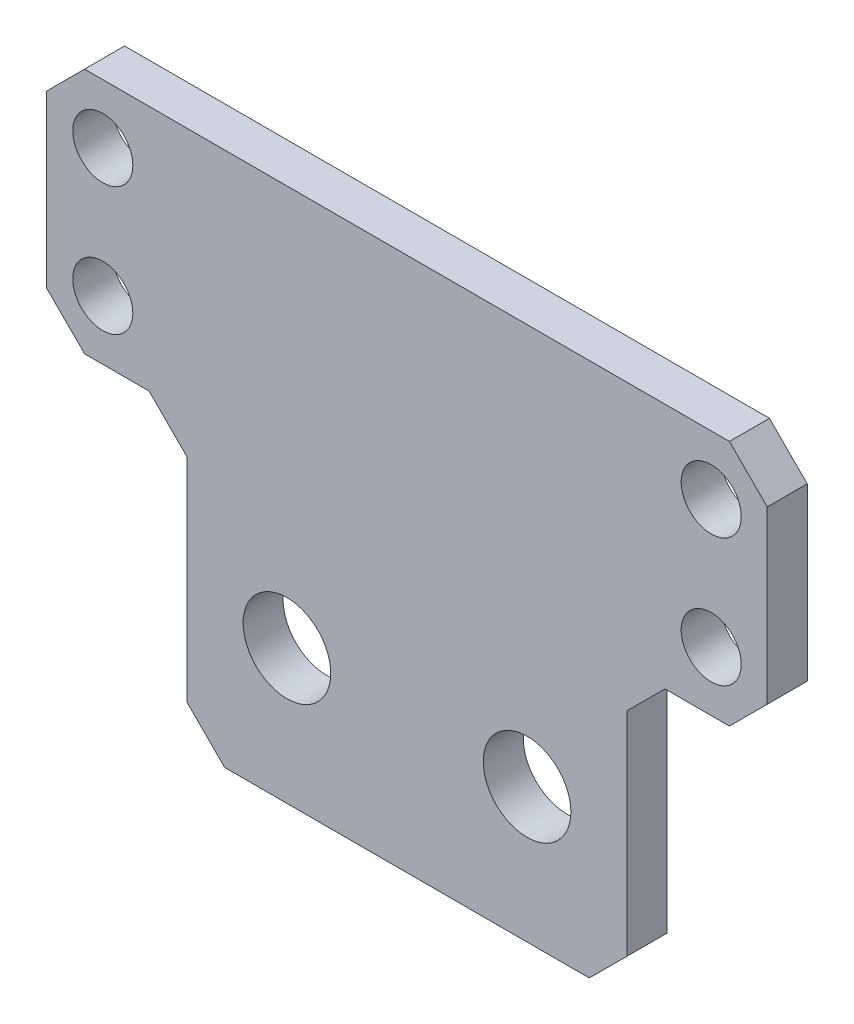
ISO-10303-21;
HEADER;
FILE_DESCRIPTION(('STEP AP214'),'2;1');
FILE_NAME('part.step','',(''),(''),'','','');
FILE_SCHEMA(('AUTOMOTIVE_DESIGN { 1 0 10303 214 1 1 1 1 }'));
ENDSEC;
DATA;
#1=APPLICATION_CONTEXT('core data for automotive mechanical design processes');
#2=APPLICATION_PROTOCOL_DEFINITION('international standard','automotive_design',2000,#1);
#3=PRODUCT_CONTEXT('',#1,'mechanical');
#4=PRODUCT('Part','Part','',(#3));
#5=PRODUCT_RELATED_PRODUCT_CATEGORY('part','',(#4));
#6=PRODUCT_DEFINITION_FORMATION('','',#4);
#7=PRODUCT_DEFINITION_CONTEXT('part definition',#1,'design');
#8=PRODUCT_DEFINITION('design','',#6,#7);
#9=PRODUCT_DEFINITION_SHAPE('','',#8);
#10=(LENGTH_UNIT() NAMED_UNIT(*) SI_UNIT(.MILLI.,.METRE.));
#11=(NAMED_UNIT(*) PLANE_ANGLE_UNIT() SI_UNIT($,.RADIAN.));
#12=(NAMED_UNIT(*) SI_UNIT($,.STERADIAN.) SOLID_ANGLE_UNIT());
#13=UNCERTAINTY_MEASURE_WITH_UNIT(LENGTH_MEASURE(1.E-05),#10,'distance_accuracy_value','');
#14=(GEOMETRIC_REPRESENTATION_CONTEXT(3) GLOBAL_UNCERTAINTY_ASSIGNED_CONTEXT((#13)) GLOBAL_UNIT_ASSIGNED_CONTEXT((#10,
#11,#12)) REPRESENTATION_CONTEXT('',''));
#15=CARTESIAN_POINT('',(0.,0.,0.));
#16=DIRECTION('',(0.,0.,1.));
#17=DIRECTION('',(1.,0.,0.));
#18=AXIS2_PLACEMENT_3D('',#15,#16,#17);
#19=CARTESIAN_POINT('',(0.,1.65099999999999,3.175));
#20=DIRECTION('',(0.,-1.,0.));
#21=DIRECTION('',(1.,0.,0.));
#22=AXIS2_PLACEMENT_3D('',#19,#20,#21);
#23=PLANE('',#22);
#24=DIRECTION('',(-1.,0.,0.));
#25=VECTOR('',#24,1.);
#26=CARTESIAN_POINT('',(0.,1.65099999999999,0.));
#27=LINE('',#26,#25);
#28=CARTESIAN_POINT('',(-20.4625,1.65099999999999,0.));
#29=VERTEX_POINT('',#28);
#30=CARTESIAN_POINT('',(-25.575,1.65099999999999,0.));
#31=VERTEX_POINT('',#30);
#32=EDGE_CURVE('E299',#29,#31,#27,.T.);
#33=ORIENTED_EDGE('',*,*,#32,.F.);
#34=DIRECTION('',(0.,0.,1.));
#35=VECTOR('',#34,1.);
#36=CARTESIAN_POINT('',(-20.4625,1.65099999999999,3.175));
#37=LINE('',#36,#35);
#38=CARTESIAN_POINT('',(-20.4625,1.65099999999999,3.175));
#39=VERTEX_POINT('',#38);
#40=EDGE_CURVE('E228',#29,#39,#37,.T.);
#41=ORIENTED_EDGE('',*,*,#40,.T.);
#42=DIRECTION('',(-1.,0.,0.));
#43=VECTOR('',#42,1.);
#44=CARTESIAN_POINT('',(0.,1.65099999999999,3.175));
#45=LINE('',#44,#43);
#46=CARTESIAN_POINT('',(-25.575,1.65099999999999,3.175));
#47=VERTEX_POINT('',#46);
#48=EDGE_CURVE('E320',#39,#47,#45,.T.);
#49=ORIENTED_EDGE('',*,*,#48,.T.);
#50=DIRECTION('',(0.,0.,-1.));
#51=VECTOR('',#50,1.);
#52=CARTESIAN_POINT('',(-25.575,1.65099999999999,3.175));
#53=LINE('',#52,#51);
#54=EDGE_CURVE('E215',#47,#31,#53,.T.);
#55=ORIENTED_EDGE('',*,*,#54,.T.);
#56=EDGE_LOOP('',(#33,#41,#49,#55));
#57=FACE_BOUND('',#56,.T.);
#58=ADVANCED_FACE('F32',(#57),#23,.T.);
#59=CARTESIAN_POINT('',(-17.4625,0.,3.175));
#60=DIRECTION('',(-1.,0.,0.));
#61=DIRECTION('',(0.,0.,1.));
#62=AXIS2_PLACEMENT_3D('',#59,#60,#61);
#63=PLANE('',#62);
#64=DIRECTION('',(0.,1.,0.));
#65=VECTOR('',#64,1.);
#66=CARTESIAN_POINT('',(-17.4625,0.,3.175));
#67=LINE('',#66,#65);
#68=CARTESIAN_POINT('',(-17.4625,-18.209,3.175));
#69=VERTEX_POINT('',#68);
#70=CARTESIAN_POINT('',(-17.4625,-1.34900000000003,3.175));
#71=VERTEX_POINT('',#70);
#72=EDGE_CURVE('E318',#69,#71,#67,.T.);
#73=ORIENTED_EDGE('',*,*,#72,.T.);
#74=DIRECTION('',(0.,0.,-1.));
#75=VECTOR('',#74,1.);
#76=CARTESIAN_POINT('',(-17.4625,-1.34900000000003,0.));
#77=LINE('',#76,#75);
#78=CARTESIAN_POINT('',(-17.4625,-1.34900000000003,0.));
#79=VERTEX_POINT('',#78);
#80=EDGE_CURVE('E225',#71,#79,#77,.T.);
#81=ORIENTED_EDGE('',*,*,#80,.T.);
#82=DIRECTION('',(0.,1.,0.));
#83=VECTOR('',#82,1.);
#84=CARTESIAN_POINT('',(-17.4625,0.,0.));
#85=LINE('',#84,#83);
#86=CARTESIAN_POINT('',(-17.4625,-18.209,0.));
#87=VERTEX_POINT('',#86);
#88=EDGE_CURVE('E301',#87,#79,#85,.T.);
#89=ORIENTED_EDGE('',*,*,#88,.F.);
#90=DIRECTION('',(0.,0.,1.));
#91=VECTOR('',#90,1.);
#92=CARTESIAN_POINT('',(-17.4625,-18.209,3.175));
#93=LINE('',#92,#91);
#94=EDGE_CURVE('E223',#87,#69,#93,.T.);
#95=ORIENTED_EDGE('',*,*,#94,.T.);
#96=EDGE_LOOP('',(#73,#81,#89,#95));
#97=FACE_BOUND('',#96,.T.);
#98=ADVANCED_FACE('F357',(#97),#63,.T.);
#99=CARTESIAN_POINT('',(0.,-21.209,3.175));
#100=DIRECTION('',(0.,-1.,0.));
#101=DIRECTION('',(1.,0.,0.));
#102=AXIS2_PLACEMENT_3D('',#99,#100,#101);
#103=PLANE('',#102);
#104=DIRECTION('',(-1.,0.,0.));
#105=VECTOR('',#104,1.);
#106=CARTESIAN_POINT('',(0.,-21.209,3.175));
#107=LINE('',#106,#105);
#108=CARTESIAN_POINT('',(14.4625,-21.209,3.175));
#109=VERTEX_POINT('',#108);
#110=CARTESIAN_POINT('',(-14.4625,-21.209,3.175));
#111=VERTEX_POINT('',#110);
#112=EDGE_CURVE('E274',#109,#111,#107,.T.);
#113=ORIENTED_EDGE('',*,*,#112,.T.);
#114=DIRECTION('',(0.,0.,-1.));
#115=VECTOR('',#114,1.);
#116=CARTESIAN_POINT('',(-14.4625,-21.209,3.175));
#117=LINE('',#116,#115);
#118=CARTESIAN_POINT('',(-14.4625,-21.209,0.));
#119=VERTEX_POINT('',#118);
#120=EDGE_CURVE('E232',#111,#119,#117,.T.);
#121=ORIENTED_EDGE('',*,*,#120,.T.);
#122=DIRECTION('',(-1.,0.,0.));
#123=VECTOR('',#122,1.);
#124=CARTESIAN_POINT('',(0.,-21.209,0.));
#125=LINE('',#124,#123);
#126=CARTESIAN_POINT('',(14.4625,-21.209,0.));
#127=VERTEX_POINT('',#126);
#128=EDGE_CURVE('E261',#127,#119,#125,.T.);
#129=ORIENTED_EDGE('',*,*,#128,.F.);
#130=DIRECTION('',(0.,0.,1.));
#131=VECTOR('',#130,1.);
#132=CARTESIAN_POINT('',(14.4625,-21.209,3.175));
#133=LINE('',#132,#131);
#134=EDGE_CURVE('E230',#127,#109,#133,.T.);
#135=ORIENTED_EDGE('',*,*,#134,.T.);
#136=EDGE_LOOP('',(#113,#121,#129,#135));
#137=FACE_BOUND('',#136,.T.);
#138=ADVANCED_FACE('F309',(#137),#103,.T.);
#139=CARTESIAN_POINT('',(17.4625,0.,3.175));
#140=DIRECTION('',(-1.,0.,0.));
#141=DIRECTION('',(0.,-1.,0.));
#142=AXIS2_PLACEMENT_3D('',#139,#140,#141);
#143=PLANE('',#142);
#144=DIRECTION('',(0.,1.,0.));
#145=VECTOR('',#144,1.);
#146=CARTESIAN_POINT('',(17.4625,0.,0.));
#147=LINE('',#146,#145);
#148=CARTESIAN_POINT('',(17.4625,-18.209,0.));
#149=VERTEX_POINT('',#148);
#150=CARTESIAN_POINT('',(17.4625,-1.34900000000002,0.));
#151=VERTEX_POINT('',#150);
#152=EDGE_CURVE('E255',#149,#151,#147,.T.);
#153=ORIENTED_EDGE('',*,*,#152,.T.);
#154=DIRECTION('',(0.,0.,1.));
#155=VECTOR('',#154,1.);
#156=CARTESIAN_POINT('',(17.4625,-1.34900000000002,3.175));
#157=LINE('',#156,#155);
#158=CARTESIAN_POINT('',(17.4625,-1.34900000000002,3.175));
#159=VERTEX_POINT('',#158);
#160=EDGE_CURVE('E53',#151,#159,#157,.T.);
#161=ORIENTED_EDGE('',*,*,#160,.T.);
#162=DIRECTION('',(0.,1.,0.));
#163=VECTOR('',#162,1.);
#164=CARTESIAN_POINT('',(17.4625,0.,3.175));
#165=LINE('',#164,#163);
#166=CARTESIAN_POINT('',(17.4625,-18.209,3.175));
#167=VERTEX_POINT('',#166);
#168=EDGE_CURVE('E270',#167,#159,#165,.T.);
#169=ORIENTED_EDGE('',*,*,#168,.F.);
#170=DIRECTION('',(0.,0.,-1.));
#171=VECTOR('',#170,1.);
#172=CARTESIAN_POINT('',(17.4625,-18.209,0.));
#173=LINE('',#172,#171);
#174=EDGE_CURVE('E246',#167,#149,#173,.T.);
#175=ORIENTED_EDGE('',*,*,#174,.T.);
#176=EDGE_LOOP('',(#153,#161,#169,#175));
#177=FACE_BOUND('',#176,.T.);
#178=ADVANCED_FACE('F259',(#177),#143,.F.);
#179=CARTESIAN_POINT('',(0.,1.651,3.175));
#180=DIRECTION('',(0.,-1.,0.));
#181=DIRECTION('',(1.,0.,0.));
#182=AXIS2_PLACEMENT_3D('',#179,#180,#181);
#183=PLANE('',#182);
#184=DIRECTION('',(-1.,0.,0.));
#185=VECTOR('',#184,1.);
#186=CARTESIAN_POINT('',(0.,1.651,3.175));
#187=LINE('',#186,#185);
#188=CARTESIAN_POINT('',(25.575,1.65099999999999,3.175));
#189=VERTEX_POINT('',#188);
#190=CARTESIAN_POINT('',(20.4625,1.65099999999999,3.175));
#191=VERTEX_POINT('',#190);
#192=EDGE_CURVE('E267',#189,#191,#187,.T.);
#193=ORIENTED_EDGE('',*,*,#192,.T.);
#194=DIRECTION('',(0.,0.,-1.));
#195=VECTOR('',#194,1.);
#196=CARTESIAN_POINT('',(20.4625,1.65099999999999,3.175));
#197=LINE('',#196,#195);
#198=CARTESIAN_POINT('',(20.4625,1.65099999999999,0.));
#199=VERTEX_POINT('',#198);
#200=EDGE_CURVE('E243',#191,#199,#197,.T.);
#201=ORIENTED_EDGE('',*,*,#200,.T.);
#202=DIRECTION('',(-1.,0.,0.));
#203=VECTOR('',#202,1.);
#204=CARTESIAN_POINT('',(0.,1.651,0.));
#205=LINE('',#204,#203);
#206=CARTESIAN_POINT('',(25.575,1.65099999999999,0.));
#207=VERTEX_POINT('',#206);
#208=EDGE_CURVE('E179',#207,#199,#205,.T.);
#209=ORIENTED_EDGE('',*,*,#208,.F.);
#210=DIRECTION('',(0.,0.,1.));
#211=VECTOR('',#210,1.);
#212=CARTESIAN_POINT('',(25.575,1.65099999999999,3.175));
#213=LINE('',#212,#211);
#214=EDGE_CURVE('E213',#207,#189,#213,.T.);
#215=ORIENTED_EDGE('',*,*,#214,.T.);
#216=EDGE_LOOP('',(#193,#201,#209,#215));
#217=FACE_BOUND('',#216,.T.);
#218=ADVANCED_FACE('F265',(#217),#183,.T.);
#219=CARTESIAN_POINT('',(28.575,0.,3.175));
#220=DIRECTION('',(-1.,0.,0.));
#221=DIRECTION('',(0.,0.,1.));
#222=AXIS2_PLACEMENT_3D('',#219,#220,#221);
#223=PLANE('',#222);
#224=DIRECTION('',(0.,1.,0.));
#225=VECTOR('',#224,1.);
#226=CARTESIAN_POINT('',(28.575,0.,0.));
#227=LINE('',#226,#225);
#228=CARTESIAN_POINT('',(28.575,4.65099999999997,0.));
#229=VERTEX_POINT('',#228);
#230=CARTESIAN_POINT('',(28.575,18.209,0.));
#231=VERTEX_POINT('',#230);
#232=EDGE_CURVE('E175',#229,#231,#227,.T.);
#233=ORIENTED_EDGE('',*,*,#232,.T.);
#234=DIRECTION('',(0.,0.,1.));
#235=VECTOR('',#234,1.);
#236=CARTESIAN_POINT('',(28.575,18.209,3.175));
#237=LINE('',#236,#235);
#238=CARTESIAN_POINT('',(28.575,18.209,3.175));
#239=VERTEX_POINT('',#238);
#240=EDGE_CURVE('E151',#231,#239,#237,.T.);
#241=ORIENTED_EDGE('',*,*,#240,.T.);
#242=DIRECTION('',(0.,1.,0.));
#243=VECTOR('',#242,1.);
#244=CARTESIAN_POINT('',(28.575,0.,3.175));
#245=LINE('',#244,#243);
#246=CARTESIAN_POINT('',(28.575,4.65099999999998,3.175));
#247=VERTEX_POINT('',#246);
#248=EDGE_CURVE('E269',#247,#239,#245,.T.);
#249=ORIENTED_EDGE('',*,*,#248,.F.);
#250=DIRECTION('',(0.,0.,-1.));
#251=VECTOR('',#250,1.);
#252=CARTESIAN_POINT('',(28.575,4.65099999999997,0.));
#253=LINE('',#252,#251);
#254=EDGE_CURVE('E156',#247,#229,#253,.T.);
#255=ORIENTED_EDGE('',*,*,#254,.T.);
#256=EDGE_LOOP('',(#233,#241,#249,#255));
#257=FACE_BOUND('',#256,.T.);
#258=ADVANCED_FACE('F372',(#257),#223,.F.);
#259=CARTESIAN_POINT('',(0.,21.209,3.175));
#260=DIRECTION('',(0.,-1.,0.));
#261=DIRECTION('',(0.,0.,-1.));
#262=AXIS2_PLACEMENT_3D('',#259,#260,#261);
#263=PLANE('',#262);
#264=DIRECTION('',(-1.,0.,0.));
#265=VECTOR('',#264,1.);
#266=CARTESIAN_POINT('',(0.,21.209,3.175));
#267=LINE('',#266,#265);
#268=CARTESIAN_POINT('',(25.575,21.209,3.175));
#269=VERTEX_POINT('',#268);
#270=CARTESIAN_POINT('',(-25.575,21.209,3.175));
#271=VERTEX_POINT('',#270);
#272=EDGE_CURVE('E166',#269,#271,#267,.T.);
#273=ORIENTED_EDGE('',*,*,#272,.F.);
#274=DIRECTION('',(0.,0.,-1.));
#275=VECTOR('',#274,1.);
#276=CARTESIAN_POINT('',(25.575,21.209,3.175));
#277=LINE('',#276,#275);
#278=CARTESIAN_POINT('',(25.575,21.209,0.));
#279=VERTEX_POINT('',#278);
#280=EDGE_CURVE('E150',#269,#279,#277,.T.);
#281=ORIENTED_EDGE('',*,*,#280,.T.);
#282=DIRECTION('',(-1.,0.,0.));
#283=VECTOR('',#282,1.);
#284=CARTESIAN_POINT('',(0.,21.209,0.));
#285=LINE('',#284,#283);
#286=CARTESIAN_POINT('',(-25.575,21.209,0.));
#287=VERTEX_POINT('',#286);
#288=EDGE_CURVE('E163',#279,#287,#285,.T.);
#289=ORIENTED_EDGE('',*,*,#288,.T.);
#290=DIRECTION('',(0.,0.,1.));
#291=VECTOR('',#290,1.);
#292=CARTESIAN_POINT('',(-25.575,21.209,3.175));
#293=LINE('',#292,#291);
#294=EDGE_CURVE('E168',#287,#271,#293,.T.);
#295=ORIENTED_EDGE('',*,*,#294,.T.);
#296=EDGE_LOOP('',(#273,#281,#289,#295));
#297=FACE_BOUND('',#296,.T.);
#298=ADVANCED_FACE('F162',(#297),#263,.F.);
#299=CARTESIAN_POINT('',(24.13,16.51,3.175));
#300=DIRECTION('',(0.,0.,-1.));
#301=DIRECTION('',(-1.,0.,0.));
#302=AXIS2_PLACEMENT_3D('',#299,#300,#301);
#303=CYLINDRICAL_SURFACE('',#302,2.3828);
#304=CARTESIAN_POINT('',(24.13,16.51,3.175));
#305=DIRECTION('',(0.,0.,1.));
#306=DIRECTION('',(1.,0.,0.));
#307=AXIS2_PLACEMENT_3D('',#304,#305,#306);
#308=CIRCLE('',#307,2.3828);
#309=CARTESIAN_POINT('',(26.5128,16.51,3.175));
#310=VERTEX_POINT('',#309);
#311=EDGE_CURVE('E288',#310,#310,#308,.T.);
#312=ORIENTED_EDGE('',*,*,#311,.T.);
#313=EDGE_LOOP('',(#312));
#314=FACE_BOUND('',#313,.T.);
#315=CARTESIAN_POINT('',(24.13,16.51,0.));
#316=DIRECTION('',(0.,0.,1.));
#317=DIRECTION('',(1.,0.,0.));
#318=AXIS2_PLACEMENT_3D('',#315,#316,#317);
#319=CIRCLE('',#318,2.3828);
#320=CARTESIAN_POINT('',(26.5128,16.51,0.));
#321=VERTEX_POINT('',#320);
#322=EDGE_CURVE('E188',#321,#321,#319,.T.);
#323=ORIENTED_EDGE('',*,*,#322,.F.);
#324=EDGE_LOOP('',(#323));
#325=FACE_BOUND('',#324,.T.);
#326=ADVANCED_FACE('F377',(#314,#325),#303,.F.);
#327=CARTESIAN_POINT('',(9.52500000000002,-10.541,3.175));
#328=DIRECTION('',(0.,0.,-1.));
#329=DIRECTION('',(-1.,0.,0.));
#330=AXIS2_PLACEMENT_3D('',#327,#328,#329);
#331=CYLINDRICAL_SURFACE('',#330,3.475);
#332=CARTESIAN_POINT('',(9.52500000000002,-10.541,3.175));
#333=DIRECTION('',(0.,0.,1.));
#334=DIRECTION('',(1.,0.,0.));
#335=AXIS2_PLACEMENT_3D('',#332,#333,#334);
#336=CIRCLE('',#335,3.475);
#337=CARTESIAN_POINT('',(13.,-10.541,3.175));
#338=VERTEX_POINT('',#337);
#339=EDGE_CURVE('E285',#338,#338,#336,.F.);
#340=ORIENTED_EDGE('',*,*,#339,.F.);
#341=EDGE_LOOP('',(#340));
#342=FACE_BOUND('',#341,.T.);
#343=CARTESIAN_POINT('',(9.52500000000002,-10.541,0.));
#344=DIRECTION('',(0.,0.,1.));
#345=DIRECTION('',(1.,0.,0.));
#346=AXIS2_PLACEMENT_3D('',#343,#344,#345);
#347=CIRCLE('',#346,3.475);
#348=CARTESIAN_POINT('',(13.,-10.541,0.));
#349=VERTEX_POINT('',#348);
#350=EDGE_CURVE('E185',#349,#349,#347,.F.);
#351=ORIENTED_EDGE('',*,*,#350,.T.);
#352=EDGE_LOOP('',(#351));
#353=FACE_BOUND('',#352,.T.);
#354=ADVANCED_FACE('F381',(#342,#353),#331,.F.);
#355=CARTESIAN_POINT('',(-9.525,-10.541,3.175));
#356=DIRECTION('',(0.,0.,-1.));
#357=DIRECTION('',(-1.,0.,0.));
#358=AXIS2_PLACEMENT_3D('',#355,#356,#357);
#359=CYLINDRICAL_SURFACE('',#358,3.475);
#360=CARTESIAN_POINT('',(-9.525,-10.541,3.175));
#361=DIRECTION('',(0.,0.,1.));
#362=DIRECTION('',(1.,0.,0.));
#363=AXIS2_PLACEMENT_3D('',#360,#361,#362);
#364=CIRCLE('',#363,3.475);
#365=CARTESIAN_POINT('',(-6.05,-10.541,3.175));
#366=VERTEX_POINT('',#365);
#367=EDGE_CURVE('E282',#366,#366,#364,.T.);
#368=ORIENTED_EDGE('',*,*,#367,.T.);
#369=EDGE_LOOP('',(#368));
#370=FACE_BOUND('',#369,.T.);
#371=CARTESIAN_POINT('',(-9.525,-10.541,0.));
#372=DIRECTION('',(0.,0.,1.));
#373=DIRECTION('',(1.,0.,0.));
#374=AXIS2_PLACEMENT_3D('',#371,#372,#373);
#375=CIRCLE('',#374,3.475);
#376=CARTESIAN_POINT('',(-6.05,-10.541,0.));
#377=VERTEX_POINT('',#376);
#378=EDGE_CURVE('E177',#377,#377,#375,.T.);
#379=ORIENTED_EDGE('',*,*,#378,.F.);
#380=EDGE_LOOP('',(#379));
#381=FACE_BOUND('',#380,.T.);
#382=ADVANCED_FACE('F352',(#370,#381),#359,.F.);
#383=CARTESIAN_POINT('',(-28.575,0.,3.175));
#384=DIRECTION('',(-1.,0.,0.));
#385=DIRECTION('',(0.,0.,1.));
#386=AXIS2_PLACEMENT_3D('',#383,#384,#385);
#387=PLANE('',#386);
#388=DIRECTION('',(0.,1.,0.));
#389=VECTOR('',#388,1.);
#390=CARTESIAN_POINT('',(-28.575,0.,0.));
#391=LINE('',#390,#389);
#392=CARTESIAN_POINT('',(-28.575,4.651,0.));
#393=VERTEX_POINT('',#392);
#394=CARTESIAN_POINT('',(-28.575,18.209,0.));
#395=VERTEX_POINT('',#394);
#396=EDGE_CURVE('E174',#393,#395,#391,.T.);
#397=ORIENTED_EDGE('',*,*,#396,.F.);
#398=DIRECTION('',(0.,0.,1.));
#399=VECTOR('',#398,1.);
#400=CARTESIAN_POINT('',(-28.575,4.651,3.175));
#401=LINE('',#400,#399);
#402=CARTESIAN_POINT('',(-28.575,4.65100000000001,3.175));
#403=VERTEX_POINT('',#402);
#404=EDGE_CURVE('E221',#393,#403,#401,.T.);
#405=ORIENTED_EDGE('',*,*,#404,.T.);
#406=DIRECTION('',(0.,1.,0.));
#407=VECTOR('',#406,1.);
#408=CARTESIAN_POINT('',(-28.575,0.,3.175));
#409=LINE('',#408,#407);
#410=CARTESIAN_POINT('',(-28.575,18.209,3.175));
#411=VERTEX_POINT('',#410);
#412=EDGE_CURVE('E279',#403,#411,#409,.T.);
#413=ORIENTED_EDGE('',*,*,#412,.T.);
#414=DIRECTION('',(0.,0.,-1.));
#415=VECTOR('',#414,1.);
#416=CARTESIAN_POINT('',(-28.575,18.209,0.));
#417=LINE('',#416,#415);
#418=EDGE_CURVE('E218',#411,#395,#417,.T.);
#419=ORIENTED_EDGE('',*,*,#418,.T.);
#420=EDGE_LOOP('',(#397,#405,#413,#419));
#421=FACE_BOUND('',#420,.T.);
#422=ADVANCED_FACE('F346',(#421),#387,.T.);
#423=CARTESIAN_POINT('',(-24.13,6.34999999999999,3.175));
#424=DIRECTION('',(0.,0.,-1.));
#425=DIRECTION('',(-1.,0.,0.));
#426=AXIS2_PLACEMENT_3D('',#423,#424,#425);
#427=CYLINDRICAL_SURFACE('',#426,2.3828);
#428=CARTESIAN_POINT('',(-24.13,6.34999999999999,3.175));
#429=DIRECTION('',(0.,0.,1.));
#430=DIRECTION('',(1.,0.,0.));
#431=AXIS2_PLACEMENT_3D('',#428,#429,#430);
#432=CIRCLE('',#431,2.3828);
#433=CARTESIAN_POINT('',(-21.7472,6.34999999999999,3.175));
#434=VERTEX_POINT('',#433);
#435=EDGE_CURVE('E324',#434,#434,#432,.T.);
#436=ORIENTED_EDGE('',*,*,#435,.T.);
#437=EDGE_LOOP('',(#436));
#438=FACE_BOUND('',#437,.T.);
#439=CARTESIAN_POINT('',(-24.13,6.34999999999999,0.));
#440=DIRECTION('',(0.,0.,1.));
#441=DIRECTION('',(1.,0.,0.));
#442=AXIS2_PLACEMENT_3D('',#439,#440,#441);
#443=CIRCLE('',#442,2.3828);
#444=CARTESIAN_POINT('',(-21.7472,6.34999999999999,0.));
#445=VERTEX_POINT('',#444);
#446=EDGE_CURVE('E296',#445,#445,#443,.T.);
#447=ORIENTED_EDGE('',*,*,#446,.F.);
#448=EDGE_LOOP('',(#447));
#449=FACE_BOUND('',#448,.T.);
#450=ADVANCED_FACE('F336',(#438,#449),#427,.F.);
#451=CARTESIAN_POINT('',(-24.13,16.51,3.175));
#452=DIRECTION('',(0.,0.,-1.));
#453=DIRECTION('',(-1.,0.,0.));
#454=AXIS2_PLACEMENT_3D('',#451,#452,#453);
#455=CYLINDRICAL_SURFACE('',#454,2.3828);
#456=CARTESIAN_POINT('',(-24.13,16.51,3.175));
#457=DIRECTION('',(0.,0.,1.));
#458=DIRECTION('',(1.,0.,0.));
#459=AXIS2_PLACEMENT_3D('',#456,#457,#458);
#460=CIRCLE('',#459,2.3828);
#461=CARTESIAN_POINT('',(-21.7472,16.51,3.175));
#462=VERTEX_POINT('',#461);
#463=EDGE_CURVE('E194',#462,#462,#460,.F.);
#464=ORIENTED_EDGE('',*,*,#463,.F.);
#465=EDGE_LOOP('',(#464));
#466=FACE_BOUND('',#465,.T.);
#467=CARTESIAN_POINT('',(-24.13,16.51,0.));
#468=DIRECTION('',(0.,0.,1.));
#469=DIRECTION('',(1.,0.,0.));
#470=AXIS2_PLACEMENT_3D('',#467,#468,#469);
#471=CIRCLE('',#470,2.3828);
#472=CARTESIAN_POINT('',(-21.7472,16.51,0.));
#473=VERTEX_POINT('',#472);
#474=EDGE_CURVE('E293',#473,#473,#471,.F.);
#475=ORIENTED_EDGE('',*,*,#474,.T.);
#476=EDGE_LOOP('',(#475));
#477=FACE_BOUND('',#476,.T.);
#478=ADVANCED_FACE('F332',(#466,#477),#455,.F.);
#479=CARTESIAN_POINT('',(24.13,6.34999999999999,3.175));
#480=DIRECTION('',(0.,0.,-1.));
#481=DIRECTION('',(-1.,0.,0.));
#482=AXIS2_PLACEMENT_3D('',#479,#480,#481);
#483=CYLINDRICAL_SURFACE('',#482,2.3828);
#484=CARTESIAN_POINT('',(24.13,6.34999999999999,3.175));
#485=DIRECTION('',(0.,0.,1.));
#486=DIRECTION('',(1.,0.,0.));
#487=AXIS2_PLACEMENT_3D('',#484,#485,#486);
#488=CIRCLE('',#487,2.3828);
#489=CARTESIAN_POINT('',(26.5128,6.34999999999999,3.175));
#490=VERTEX_POINT('',#489);
#491=EDGE_CURVE('E195',#490,#490,#488,.F.);
#492=ORIENTED_EDGE('',*,*,#491,.F.);
#493=EDGE_LOOP('',(#492));
#494=FACE_BOUND('',#493,.T.);
#495=CARTESIAN_POINT('',(24.13,6.34999999999999,0.));
#496=DIRECTION('',(0.,0.,1.));
#497=DIRECTION('',(1.,0.,0.));
#498=AXIS2_PLACEMENT_3D('',#495,#496,#497);
#499=CIRCLE('',#498,2.3828);
#500=CARTESIAN_POINT('',(26.5128,6.34999999999999,0.));
#501=VERTEX_POINT('',#500);
#502=EDGE_CURVE('E191',#501,#501,#499,.F.);
#503=ORIENTED_EDGE('',*,*,#502,.T.);
#504=EDGE_LOOP('',(#503));
#505=FACE_BOUND('',#504,.T.);
#506=ADVANCED_FACE('F335',(#494,#505),#483,.F.);
#507=CARTESIAN_POINT('',(0.,0.,3.175));
#508=DIRECTION('',(0.,0.,1.));
#509=DIRECTION('',(1.,0.,0.));
#510=AXIS2_PLACEMENT_3D('',#507,#508,#509);
#511=PLANE('',#510);
#512=ORIENTED_EDGE('',*,*,#463,.T.);
#513=EDGE_LOOP('',(#512));
#514=FACE_BOUND('',#513,.T.);
#515=ORIENTED_EDGE('',*,*,#435,.F.);
#516=EDGE_LOOP('',(#515));
#517=FACE_BOUND('',#516,.T.);
#518=ORIENTED_EDGE('',*,*,#72,.F.);
#519=DIRECTION('',(-0.707106781186546,0.707106781186549,0.));
#520=VECTOR('',#519,1.);
#521=CARTESIAN_POINT('',(-17.83575,-17.83575,3.175));
#522=LINE('',#521,#520);
#523=EDGE_CURVE('E241',#69,#111,#522,.F.);
#524=ORIENTED_EDGE('',*,*,#523,.T.);
#525=ORIENTED_EDGE('',*,*,#112,.F.);
#526=DIRECTION('',(0.70710678118655,0.707106781186545,0.));
#527=VECTOR('',#526,1.);
#528=CARTESIAN_POINT('',(17.83575,-17.8357500000001,3.175));
#529=LINE('',#528,#527);
#530=EDGE_CURVE('E239',#109,#167,#529,.T.);
#531=ORIENTED_EDGE('',*,*,#530,.T.);
#532=ORIENTED_EDGE('',*,*,#168,.T.);
#533=DIRECTION('',(0.707106781186551,0.707106781186544,0.));
#534=VECTOR('',#533,1.);
#535=CARTESIAN_POINT('',(20.4625,1.65099999999999,3.175));
#536=LINE('',#535,#534);
#537=EDGE_CURVE('E11',#159,#191,#536,.T.);
#538=ORIENTED_EDGE('',*,*,#537,.T.);
#539=ORIENTED_EDGE('',*,*,#192,.F.);
#540=DIRECTION('',(0.707106781186549,0.707106781186546,0.));
#541=VECTOR('',#540,1.);
#542=CARTESIAN_POINT('',(11.9619999999999,-11.962,3.175));
#543=LINE('',#542,#541);
#544=EDGE_CURVE('E209',#189,#247,#543,.T.);
#545=ORIENTED_EDGE('',*,*,#544,.T.);
#546=ORIENTED_EDGE('',*,*,#248,.T.);
#547=DIRECTION('',(0.707106781186547,-0.707106781186548,0.));
#548=VECTOR('',#547,1.);
#549=CARTESIAN_POINT('',(23.392,23.392,3.175));
#550=LINE('',#549,#548);
#551=EDGE_CURVE('E211',#239,#269,#550,.F.);
#552=ORIENTED_EDGE('',*,*,#551,.T.);
#553=ORIENTED_EDGE('',*,*,#272,.T.);
#554=DIRECTION('',(-0.707106781186548,-0.707106781186547,0.));
#555=VECTOR('',#554,1.);
#556=CARTESIAN_POINT('',(-23.392,23.392,3.175));
#557=LINE('',#556,#555);
#558=EDGE_CURVE('E204',#271,#411,#557,.T.);
#559=ORIENTED_EDGE('',*,*,#558,.T.);
#560=ORIENTED_EDGE('',*,*,#412,.F.);
#561=DIRECTION('',(-0.707106781186546,0.707106781186549,0.));
#562=VECTOR('',#561,1.);
#563=CARTESIAN_POINT('',(-11.9620000000001,-11.962,3.175));
#564=LINE('',#563,#562);
#565=EDGE_CURVE('E206',#403,#47,#564,.F.);
#566=ORIENTED_EDGE('',*,*,#565,.T.);
#567=ORIENTED_EDGE('',*,*,#48,.F.);
#568=DIRECTION('',(-0.707106781186543,0.707106781186552,0.));
#569=VECTOR('',#568,1.);
#570=CARTESIAN_POINT('',(-17.4625,-1.34900000000003,3.175));
#571=LINE('',#570,#569);
#572=EDGE_CURVE('E252',#39,#71,#571,.F.);
#573=ORIENTED_EDGE('',*,*,#572,.T.);
#574=EDGE_LOOP('',(#518,#524,#525,#531,#532,#538,#539,#545,#546,#552,#553,#559,#560,#566,#567,#573));
#575=FACE_BOUND('',#574,.T.);
#576=ORIENTED_EDGE('',*,*,#367,.F.);
#577=EDGE_LOOP('',(#576));
#578=FACE_BOUND('',#577,.T.);
#579=ORIENTED_EDGE('',*,*,#339,.T.);
#580=EDGE_LOOP('',(#579));
#581=FACE_BOUND('',#580,.T.);
#582=ORIENTED_EDGE('',*,*,#311,.F.);
#583=EDGE_LOOP('',(#582));
#584=FACE_BOUND('',#583,.T.);
#585=ORIENTED_EDGE('',*,*,#491,.T.);
#586=EDGE_LOOP('',(#585));
#587=FACE_BOUND('',#586,.T.);
#588=ADVANCED_FACE('F315',(#514,#517,#575,#578,#581,#584,#587),#511,.T.);
#589=CARTESIAN_POINT('',(0.,0.,0.));
#590=DIRECTION('',(0.,0.,1.));
#591=DIRECTION('',(1.,0.,0.));
#592=AXIS2_PLACEMENT_3D('',#589,#590,#591);
#593=PLANE('',#592);
#594=ORIENTED_EDGE('',*,*,#474,.F.);
#595=EDGE_LOOP('',(#594));
#596=FACE_BOUND('',#595,.T.);
#597=ORIENTED_EDGE('',*,*,#446,.T.);
#598=EDGE_LOOP('',(#597));
#599=FACE_BOUND('',#598,.T.);
#600=ORIENTED_EDGE('',*,*,#128,.T.);
#601=DIRECTION('',(0.707106781186546,-0.707106781186549,0.));
#602=VECTOR('',#601,1.);
#603=CARTESIAN_POINT('',(-14.4625,-21.209,0.));
#604=LINE('',#603,#602);
#605=EDGE_CURVE('E237',#119,#87,#604,.F.);
#606=ORIENTED_EDGE('',*,*,#605,.T.);
#607=ORIENTED_EDGE('',*,*,#88,.T.);
#608=DIRECTION('',(0.707106781186543,-0.707106781186552,0.));
#609=VECTOR('',#608,1.);
#610=CARTESIAN_POINT('',(-9.40575000000011,-9.40575,0.));
#611=LINE('',#610,#609);
#612=EDGE_CURVE('E250',#79,#29,#611,.F.);
#613=ORIENTED_EDGE('',*,*,#612,.T.);
#614=ORIENTED_EDGE('',*,*,#32,.T.);
#615=DIRECTION('',(0.707106781186546,-0.707106781186549,0.));
#616=VECTOR('',#615,1.);
#617=CARTESIAN_POINT('',(-25.575,1.65099999999999,0.));
#618=LINE('',#617,#616);
#619=EDGE_CURVE('E198',#31,#393,#618,.F.);
#620=ORIENTED_EDGE('',*,*,#619,.T.);
#621=ORIENTED_EDGE('',*,*,#396,.T.);
#622=DIRECTION('',(0.707106781186548,0.707106781186547,0.));
#623=VECTOR('',#622,1.);
#624=CARTESIAN_POINT('',(-28.575,18.209,0.));
#625=LINE('',#624,#623);
#626=EDGE_CURVE('E167',#395,#287,#625,.T.);
#627=ORIENTED_EDGE('',*,*,#626,.T.);
#628=ORIENTED_EDGE('',*,*,#288,.F.);
#629=DIRECTION('',(-0.707106781186547,0.707106781186548,0.));
#630=VECTOR('',#629,1.);
#631=CARTESIAN_POINT('',(25.575,21.209,0.));
#632=LINE('',#631,#630);
#633=EDGE_CURVE('E146',#279,#231,#632,.F.);
#634=ORIENTED_EDGE('',*,*,#633,.T.);
#635=ORIENTED_EDGE('',*,*,#232,.F.);
#636=DIRECTION('',(-0.707106781186549,-0.707106781186546,0.));
#637=VECTOR('',#636,1.);
#638=CARTESIAN_POINT('',(28.575,4.65099999999997,0.));
#639=LINE('',#638,#637);
#640=EDGE_CURVE('E157',#229,#207,#639,.T.);
#641=ORIENTED_EDGE('',*,*,#640,.T.);
#642=ORIENTED_EDGE('',*,*,#208,.T.);
#643=DIRECTION('',(-0.707106781186551,-0.707106781186544,0.));
#644=VECTOR('',#643,1.);
#645=CARTESIAN_POINT('',(9.40574999999992,-9.40575000000001,0.));
#646=LINE('',#645,#644);
#647=EDGE_CURVE('E40',#199,#151,#646,.T.);
#648=ORIENTED_EDGE('',*,*,#647,.T.);
#649=ORIENTED_EDGE('',*,*,#152,.F.);
#650=DIRECTION('',(-0.70710678118655,-0.707106781186545,0.));
#651=VECTOR('',#650,1.);
#652=CARTESIAN_POINT('',(17.4625,-18.209,0.));
#653=LINE('',#652,#651);
#654=EDGE_CURVE('E235',#149,#127,#653,.T.);
#655=ORIENTED_EDGE('',*,*,#654,.T.);
#656=EDGE_LOOP('',(#600,#606,#607,#613,#614,#620,#621,#627,#628,#634,#635,#641,#642,#648,#649,#655));
#657=FACE_BOUND('',#656,.T.);
#658=ORIENTED_EDGE('',*,*,#378,.T.);
#659=EDGE_LOOP('',(#658));
#660=FACE_BOUND('',#659,.T.);
#661=ORIENTED_EDGE('',*,*,#350,.F.);
#662=EDGE_LOOP('',(#661));
#663=FACE_BOUND('',#662,.T.);
#664=ORIENTED_EDGE('',*,*,#322,.T.);
#665=EDGE_LOOP('',(#664));
#666=FACE_BOUND('',#665,.T.);
#667=ORIENTED_EDGE('',*,*,#502,.F.);
#668=EDGE_LOOP('',(#667));
#669=FACE_BOUND('',#668,.T.);
#670=ADVANCED_FACE('F171',(#596,#599,#657,#660,#663,#666,#669),#593,.F.);
#671=CARTESIAN_POINT('',(25.575,21.209,3.175));
#672=DIRECTION('',(-0.707106781186548,-0.707106781186547,0.));
#673=DIRECTION('',(0.,0.,-1.));
#674=AXIS2_PLACEMENT_3D('',#671,#672,#673);
#675=PLANE('',#674);
#676=ORIENTED_EDGE('',*,*,#551,.F.);
#677=ORIENTED_EDGE('',*,*,#240,.F.);
#678=ORIENTED_EDGE('',*,*,#633,.F.);
#679=ORIENTED_EDGE('',*,*,#280,.F.);
#680=EDGE_LOOP('',(#676,#677,#678,#679));
#681=FACE_BOUND('',#680,.T.);
#682=ADVANCED_FACE('F149',(#681),#675,.F.);
#683=CARTESIAN_POINT('',(28.575,4.65099999999997,3.175));
#684=DIRECTION('',(0.707106781186546,-0.707106781186549,0.));
#685=DIRECTION('',(0.,0.,1.));
#686=AXIS2_PLACEMENT_3D('',#683,#684,#685);
#687=PLANE('',#686);
#688=ORIENTED_EDGE('',*,*,#544,.F.);
#689=ORIENTED_EDGE('',*,*,#214,.F.);
#690=ORIENTED_EDGE('',*,*,#640,.F.);
#691=ORIENTED_EDGE('',*,*,#254,.F.);
#692=EDGE_LOOP('',(#688,#689,#690,#691));
#693=FACE_BOUND('',#692,.T.);
#694=ADVANCED_FACE('F409',(#693),#687,.T.);
#695=CARTESIAN_POINT('',(-25.575,1.65099999999999,3.175));
#696=DIRECTION('',(0.707106781186549,0.707106781186546,0.));
#697=DIRECTION('',(0.,0.,-1.));
#698=AXIS2_PLACEMENT_3D('',#695,#696,#697);
#699=PLANE('',#698);
#700=ORIENTED_EDGE('',*,*,#565,.F.);
#701=ORIENTED_EDGE('',*,*,#404,.F.);
#702=ORIENTED_EDGE('',*,*,#619,.F.);
#703=ORIENTED_EDGE('',*,*,#54,.F.);
#704=EDGE_LOOP('',(#700,#701,#702,#703));
#705=FACE_BOUND('',#704,.T.);
#706=ADVANCED_FACE('F417',(#705),#699,.F.);
#707=CARTESIAN_POINT('',(-28.575,18.209,3.175));
#708=DIRECTION('',(-0.707106781186547,0.707106781186548,0.));
#709=DIRECTION('',(0.,0.,1.));
#710=AXIS2_PLACEMENT_3D('',#707,#708,#709);
#711=PLANE('',#710);
#712=ORIENTED_EDGE('',*,*,#558,.F.);
#713=ORIENTED_EDGE('',*,*,#294,.F.);
#714=ORIENTED_EDGE('',*,*,#626,.F.);
#715=ORIENTED_EDGE('',*,*,#418,.F.);
#716=EDGE_LOOP('',(#712,#713,#714,#715));
#717=FACE_BOUND('',#716,.T.);
#718=ADVANCED_FACE('F425',(#717),#711,.T.);
#719=CARTESIAN_POINT('',(-17.4625,-1.34900000000003,3.175));
#720=DIRECTION('',(-0.707106781186552,-0.707106781186543,0.));
#721=DIRECTION('',(0.,0.,1.));
#722=AXIS2_PLACEMENT_3D('',#719,#720,#721);
#723=PLANE('',#722);
#724=ORIENTED_EDGE('',*,*,#572,.F.);
#725=ORIENTED_EDGE('',*,*,#40,.F.);
#726=ORIENTED_EDGE('',*,*,#612,.F.);
#727=ORIENTED_EDGE('',*,*,#80,.F.);
#728=EDGE_LOOP('',(#724,#725,#726,#727));
#729=FACE_BOUND('',#728,.T.);
#730=ADVANCED_FACE('F433',(#729),#723,.T.);
#731=CARTESIAN_POINT('',(-14.4625,-21.209,3.175));
#732=DIRECTION('',(0.707106781186549,0.707106781186546,0.));
#733=DIRECTION('',(0.,0.,-1.));
#734=AXIS2_PLACEMENT_3D('',#731,#732,#733);
#735=PLANE('',#734);
#736=ORIENTED_EDGE('',*,*,#523,.F.);
#737=ORIENTED_EDGE('',*,*,#94,.F.);
#738=ORIENTED_EDGE('',*,*,#605,.F.);
#739=ORIENTED_EDGE('',*,*,#120,.F.);
#740=EDGE_LOOP('',(#736,#737,#738,#739));
#741=FACE_BOUND('',#740,.T.);
#742=ADVANCED_FACE('F440',(#741),#735,.F.);
#743=CARTESIAN_POINT('',(20.4625,1.65099999999999,3.175));
#744=DIRECTION('',(-0.707106781186544,0.707106781186551,0.));
#745=DIRECTION('',(0.,0.,-1.));
#746=AXIS2_PLACEMENT_3D('',#743,#744,#745);
#747=PLANE('',#746);
#748=ORIENTED_EDGE('',*,*,#537,.F.);
#749=ORIENTED_EDGE('',*,*,#160,.F.);
#750=ORIENTED_EDGE('',*,*,#647,.F.);
#751=ORIENTED_EDGE('',*,*,#200,.F.);
#752=EDGE_LOOP('',(#748,#749,#750,#751));
#753=FACE_BOUND('',#752,.T.);
#754=ADVANCED_FACE('F263',(#753),#747,.F.);
#755=CARTESIAN_POINT('',(17.4625,-18.209,3.175));
#756=DIRECTION('',(0.707106781186545,-0.70710678118655,0.));
#757=DIRECTION('',(0.,0.,1.));
#758=AXIS2_PLACEMENT_3D('',#755,#756,#757);
#759=PLANE('',#758);
#760=ORIENTED_EDGE('',*,*,#530,.F.);
#761=ORIENTED_EDGE('',*,*,#134,.F.);
#762=ORIENTED_EDGE('',*,*,#654,.F.);
#763=ORIENTED_EDGE('',*,*,#174,.F.);
#764=EDGE_LOOP('',(#760,#761,#762,#763));
#765=FACE_BOUND('',#764,.T.);
#766=ADVANCED_FACE('F34',(#765),#759,.T.);
#767=CLOSED_SHELL('',(#58,#98,#138,#178,#218,#258,#298,#326,#354,#382,#422,#450,#478,#506,#588,
#670,#682,#694,#706,#718,#730,#742,#754,#766));
#768=MANIFOLD_SOLID_BREP('B2',#767);
#769=ADVANCED_BREP_SHAPE_REPRESENTATION('',(#18,#768),#14);
#770=SHAPE_DEFINITION_REPRESENTATION(#9,#769);
ENDSEC;
END-ISO-10303-21;
